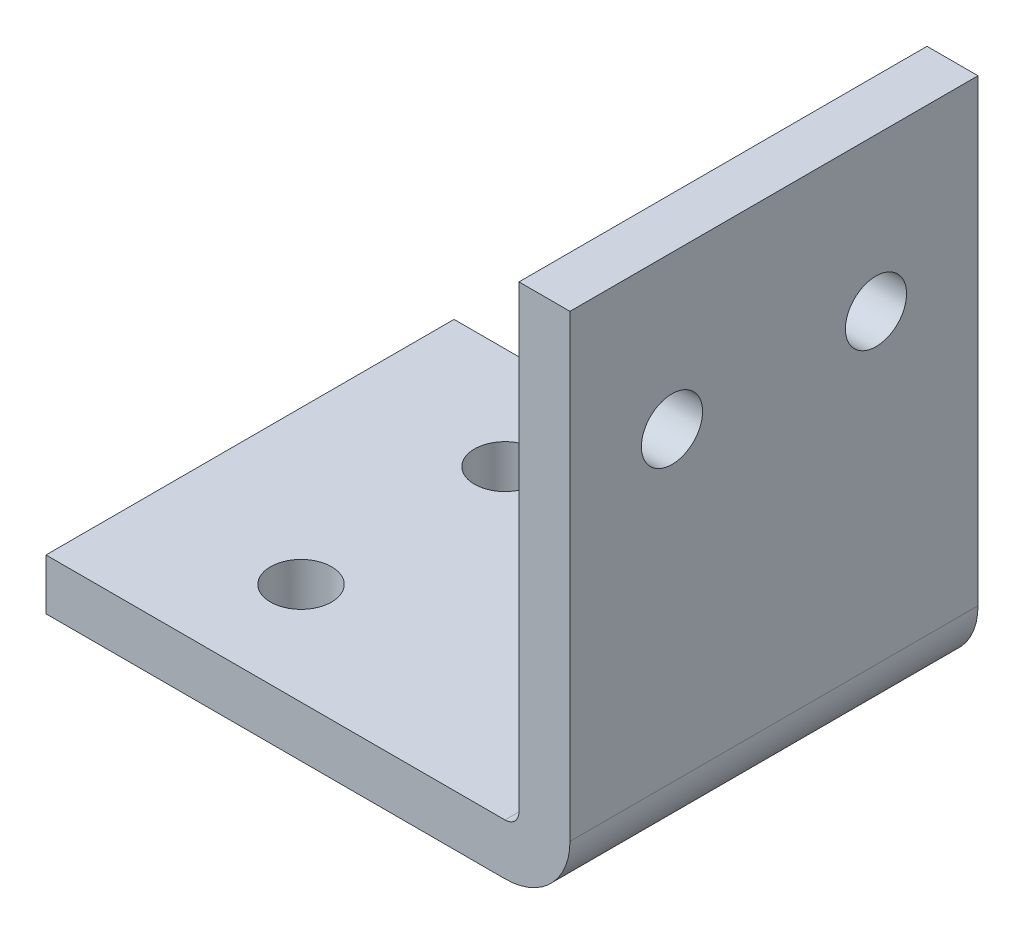
ISO-10303-21;
HEADER;
FILE_DESCRIPTION(('STEP AP214'),'2;1');
FILE_NAME('part.step','',(''),(''),'','','');
FILE_SCHEMA(('AUTOMOTIVE_DESIGN { 1 0 10303 214 1 1 1 1 }'));
ENDSEC;
DATA;
#1=APPLICATION_CONTEXT('core data for automotive mechanical design processes');
#2=APPLICATION_PROTOCOL_DEFINITION('international standard','automotive_design',2000,#1);
#3=PRODUCT_CONTEXT('',#1,'mechanical');
#4=PRODUCT('Part','Part','',(#3));
#5=PRODUCT_RELATED_PRODUCT_CATEGORY('part','',(#4));
#6=PRODUCT_DEFINITION_FORMATION('','',#4);
#7=PRODUCT_DEFINITION_CONTEXT('part definition',#1,'design');
#8=PRODUCT_DEFINITION('design','',#6,#7);
#9=PRODUCT_DEFINITION_SHAPE('','',#8);
#10=(LENGTH_UNIT() NAMED_UNIT(*) SI_UNIT(.MILLI.,.METRE.));
#11=(NAMED_UNIT(*) PLANE_ANGLE_UNIT() SI_UNIT($,.RADIAN.));
#12=(NAMED_UNIT(*) SI_UNIT($,.STERADIAN.) SOLID_ANGLE_UNIT());
#13=UNCERTAINTY_MEASURE_WITH_UNIT(LENGTH_MEASURE(1.E-05),#10,'distance_accuracy_value','');
#14=(GEOMETRIC_REPRESENTATION_CONTEXT(3) GLOBAL_UNCERTAINTY_ASSIGNED_CONTEXT((#13)) GLOBAL_UNIT_ASSIGNED_CONTEXT((#10,
#11,#12)) REPRESENTATION_CONTEXT('',''));
#15=CARTESIAN_POINT('',(0.,0.,0.));
#16=DIRECTION('',(0.,0.,1.));
#17=DIRECTION('',(1.,0.,0.));
#18=AXIS2_PLACEMENT_3D('',#15,#16,#17);
#19=CARTESIAN_POINT('',(-5.,6.3661977236758,0.));
#20=DIRECTION('',(0.,0.,-1.));
#21=DIRECTION('',(1.,0.,0.));
#22=AXIS2_PLACEMENT_3D('',#19,#20,#21);
#23=CYLINDRICAL_SURFACE('',#22,6.3661977236758);
#24=DIRECTION('',(0.,0.,-1.));
#25=VECTOR('',#24,1.);
#26=CARTESIAN_POINT('',(1.3661977236758,6.36619772367582,0.));
#27=LINE('',#26,#25);
#28=CARTESIAN_POINT('',(1.3661977236758,6.36619772367582,0.));
#29=VERTEX_POINT('',#28);
#30=CARTESIAN_POINT('',(1.36619772367581,6.36619772367582,-40.));
#31=VERTEX_POINT('',#30);
#32=EDGE_CURVE('E302',#29,#31,#27,.T.);
#33=ORIENTED_EDGE('',*,*,#32,.F.);
#34=CARTESIAN_POINT('',(-5.,6.3661977236758,0.));
#35=DIRECTION('',(0.,0.,-1.));
#36=DIRECTION('',(-1.,0.,0.));
#37=AXIS2_PLACEMENT_3D('',#34,#35,#36);
#38=CIRCLE('',#37,6.3661977236758);
#39=CARTESIAN_POINT('',(-5.,0.,0.));
#40=VERTEX_POINT('',#39);
#41=EDGE_CURVE('E355',#40,#29,#38,.F.);
#42=ORIENTED_EDGE('',*,*,#41,.F.);
#43=DIRECTION('',(0.,0.,-1.));
#44=VECTOR('',#43,1.);
#45=CARTESIAN_POINT('',(-5.00000000000001,0.,0.));
#46=LINE('',#45,#44);
#47=CARTESIAN_POINT('',(-5.,0.,-40.));
#48=VERTEX_POINT('',#47);
#49=EDGE_CURVE('E306',#40,#48,#46,.T.);
#50=ORIENTED_EDGE('',*,*,#49,.T.);
#51=CARTESIAN_POINT('',(-5.,6.3661977236758,-40.));
#52=DIRECTION('',(0.,0.,-1.));
#53=DIRECTION('',(-1.,0.,0.));
#54=AXIS2_PLACEMENT_3D('',#51,#52,#53);
#55=CIRCLE('',#54,6.3661977236758);
#56=EDGE_CURVE('E107',#31,#48,#55,.T.);
#57=ORIENTED_EDGE('',*,*,#56,.F.);
#58=EDGE_LOOP('',(#33,#42,#50,#57));
#59=FACE_BOUND('',#58,.T.);
#60=ADVANCED_FACE('F103',(#59),#23,.T.);
#61=CARTESIAN_POINT('',(0.,5.,0.));
#62=DIRECTION('',(0.,1.,0.));
#63=DIRECTION('',(0.,0.,1.));
#64=AXIS2_PLACEMENT_3D('',#61,#62,#63);
#65=PLANE('',#64);
#66=CARTESIAN_POINT('',(-35.,5.,-30.));
#67=DIRECTION('',(0.,1.,0.));
#68=DIRECTION('',(0.,0.,1.));
#69=AXIS2_PLACEMENT_3D('',#66,#67,#68);
#70=CIRCLE('',#69,2.99999999999999);
#71=CARTESIAN_POINT('',(-35.,5.,-27.));
#72=VERTEX_POINT('',#71);
#73=EDGE_CURVE('E412',#72,#72,#70,.T.);
#74=ORIENTED_EDGE('',*,*,#73,.F.);
#75=EDGE_LOOP('',(#74));
#76=FACE_BOUND('',#75,.T.);
#77=CARTESIAN_POINT('',(-35.,5.,-10.));
#78=DIRECTION('',(0.,1.,0.));
#79=DIRECTION('',(0.,0.,-1.));
#80=AXIS2_PLACEMENT_3D('',#77,#78,#79);
#81=CIRCLE('',#80,2.99999999999999);
#82=CARTESIAN_POINT('',(-35.,5.,-13.));
#83=VERTEX_POINT('',#82);
#84=EDGE_CURVE('E418',#83,#83,#81,.T.);
#85=ORIENTED_EDGE('',*,*,#84,.F.);
#86=EDGE_LOOP('',(#85));
#87=FACE_BOUND('',#86,.T.);
#88=DIRECTION('',(0.,0.,-1.));
#89=VECTOR('',#88,1.);
#90=CARTESIAN_POINT('',(-5.00000000000001,5.,0.));
#91=LINE('',#90,#89);
#92=CARTESIAN_POINT('',(-5.00000000000001,5.,-11.5));
#93=VERTEX_POINT('',#92);
#94=CARTESIAN_POINT('',(-5.,5.,-28.5));
#95=VERTEX_POINT('',#94);
#96=EDGE_CURVE('E314',#93,#95,#91,.T.);
#97=ORIENTED_EDGE('',*,*,#96,.T.);
#98=DIRECTION('',(-1.,0.,0.));
#99=VECTOR('',#98,1.);
#100=CARTESIAN_POINT('',(0.,5.,-28.5));
#101=LINE('',#100,#99);
#102=CARTESIAN_POINT('',(-10.,5.,-28.5));
#103=VERTEX_POINT('',#102);
#104=EDGE_CURVE('E232',#95,#103,#101,.T.);
#105=ORIENTED_EDGE('',*,*,#104,.T.);
#106=DIRECTION('',(0.,0.,-1.));
#107=VECTOR('',#106,1.);
#108=CARTESIAN_POINT('',(-10.,5.,0.));
#109=LINE('',#108,#107);
#110=CARTESIAN_POINT('',(-10.,5.,-31.5));
#111=VERTEX_POINT('',#110);
#112=EDGE_CURVE('E231',#103,#111,#109,.T.);
#113=ORIENTED_EDGE('',*,*,#112,.T.);
#114=DIRECTION('',(-1.,0.,0.));
#115=VECTOR('',#114,1.);
#116=CARTESIAN_POINT('',(0.,5.,-31.5));
#117=LINE('',#116,#115);
#118=CARTESIAN_POINT('',(-5.,5.,-31.5));
#119=VERTEX_POINT('',#118);
#120=EDGE_CURVE('E236',#119,#111,#117,.T.);
#121=ORIENTED_EDGE('',*,*,#120,.F.);
#122=CARTESIAN_POINT('',(-5.,5.,-40.));
#123=VERTEX_POINT('',#122);
#124=EDGE_CURVE('E315',#119,#123,#91,.T.);
#125=ORIENTED_EDGE('',*,*,#124,.T.);
#126=DIRECTION('',(-1.,0.,0.));
#127=VECTOR('',#126,1.);
#128=CARTESIAN_POINT('',(50.,5.,-40.));
#129=LINE('',#128,#127);
#130=CARTESIAN_POINT('',(-50.,5.,-40.));
#131=VERTEX_POINT('',#130);
#132=EDGE_CURVE('E354',#123,#131,#129,.T.);
#133=ORIENTED_EDGE('',*,*,#132,.T.);
#134=DIRECTION('',(0.,0.,1.));
#135=VECTOR('',#134,1.);
#136=CARTESIAN_POINT('',(-50.,5.,0.));
#137=LINE('',#136,#135);
#138=CARTESIAN_POINT('',(-50.,5.,0.));
#139=VERTEX_POINT('',#138);
#140=EDGE_CURVE('E350',#131,#139,#137,.T.);
#141=ORIENTED_EDGE('',*,*,#140,.T.);
#142=DIRECTION('',(1.,0.,0.));
#143=VECTOR('',#142,1.);
#144=CARTESIAN_POINT('',(-50.,5.,0.));
#145=LINE('',#144,#143);
#146=CARTESIAN_POINT('',(-5.,5.,0.));
#147=VERTEX_POINT('',#146);
#148=EDGE_CURVE('E310',#139,#147,#145,.T.);
#149=ORIENTED_EDGE('',*,*,#148,.T.);
#150=CARTESIAN_POINT('',(-5.00000000000001,5.,-8.5));
#151=VERTEX_POINT('',#150);
#152=EDGE_CURVE('E311',#147,#151,#91,.T.);
#153=ORIENTED_EDGE('',*,*,#152,.T.);
#154=DIRECTION('',(-1.,0.,0.));
#155=VECTOR('',#154,1.);
#156=CARTESIAN_POINT('',(0.,5.,-8.5));
#157=LINE('',#156,#155);
#158=CARTESIAN_POINT('',(-10.,5.,-8.5));
#159=VERTEX_POINT('',#158);
#160=EDGE_CURVE('E129',#151,#159,#157,.T.);
#161=ORIENTED_EDGE('',*,*,#160,.T.);
#162=DIRECTION('',(0.,0.,-1.));
#163=VECTOR('',#162,1.);
#164=CARTESIAN_POINT('',(-10.,5.,0.));
#165=LINE('',#164,#163);
#166=CARTESIAN_POINT('',(-10.,5.,-11.5));
#167=VERTEX_POINT('',#166);
#168=EDGE_CURVE('E294',#159,#167,#165,.T.);
#169=ORIENTED_EDGE('',*,*,#168,.T.);
#170=DIRECTION('',(-1.,0.,0.));
#171=VECTOR('',#170,1.);
#172=CARTESIAN_POINT('',(0.,5.,-11.5));
#173=LINE('',#172,#171);
#174=EDGE_CURVE('E278',#93,#167,#173,.T.);
#175=ORIENTED_EDGE('',*,*,#174,.F.);
#176=EDGE_LOOP('',(#97,#105,#113,#121,#125,#133,#141,#149,#153,#161,#169,#175));
#177=FACE_BOUND('',#176,.T.);
#178=ADVANCED_FACE('F461',(#76,#87,#177),#65,.T.);
#179=CARTESIAN_POINT('',(-3.63380227632418,1.3661977236758,0.));
#180=DIRECTION('',(-1.,0.,0.));
#181=DIRECTION('',(0.,0.,1.));
#182=AXIS2_PLACEMENT_3D('',#179,#180,#181);
#183=PLANE('',#182);
#184=CARTESIAN_POINT('',(-3.63380227632427,36.3661977236758,-30.));
#185=DIRECTION('',(-1.,0.,0.));
#186=DIRECTION('',(0.,0.,-1.));
#187=AXIS2_PLACEMENT_3D('',#184,#185,#186);
#188=CIRCLE('',#187,2.99999999999999);
#189=CARTESIAN_POINT('',(-3.63380227632427,36.3661977236758,-33.));
#190=VERTEX_POINT('',#189);
#191=EDGE_CURVE('E297',#190,#190,#188,.T.);
#192=ORIENTED_EDGE('',*,*,#191,.F.);
#193=EDGE_LOOP('',(#192));
#194=FACE_BOUND('',#193,.T.);
#195=CARTESIAN_POINT('',(-3.63380227632427,36.3661977236758,-10.));
#196=DIRECTION('',(-1.,0.,0.));
#197=DIRECTION('',(0.,0.,1.));
#198=AXIS2_PLACEMENT_3D('',#195,#196,#197);
#199=CIRCLE('',#198,2.99999999999999);
#200=CARTESIAN_POINT('',(-3.63380227632427,36.3661977236758,-7.00000000000001));
#201=VERTEX_POINT('',#200);
#202=EDGE_CURVE('E424',#201,#201,#199,.T.);
#203=ORIENTED_EDGE('',*,*,#202,.F.);
#204=EDGE_LOOP('',(#203));
#205=FACE_BOUND('',#204,.T.);
#206=DIRECTION('',(0.,0.,1.));
#207=VECTOR('',#206,1.);
#208=CARTESIAN_POINT('',(-3.63380227632421,11.3661977236758,0.));
#209=LINE('',#208,#207);
#210=CARTESIAN_POINT('',(-3.63380227632421,11.3661977236758,-31.5));
#211=VERTEX_POINT('',#210);
#212=CARTESIAN_POINT('',(-3.63380227632421,11.3661977236758,-28.5));
#213=VERTEX_POINT('',#212);
#214=EDGE_CURVE('E222',#211,#213,#209,.T.);
#215=ORIENTED_EDGE('',*,*,#214,.T.);
#216=DIRECTION('',(0.,-1.,0.));
#217=VECTOR('',#216,1.);
#218=CARTESIAN_POINT('',(-3.63380227632418,1.3661977236758,-28.5));
#219=LINE('',#218,#217);
#220=CARTESIAN_POINT('',(-3.63380227632419,6.36619772367581,-28.5));
#221=VERTEX_POINT('',#220);
#222=EDGE_CURVE('E254',#213,#221,#219,.T.);
#223=ORIENTED_EDGE('',*,*,#222,.T.);
#224=DIRECTION('',(0.,0.,-1.));
#225=VECTOR('',#224,1.);
#226=CARTESIAN_POINT('',(-3.6338022763242,6.36619772367581,0.));
#227=LINE('',#226,#225);
#228=CARTESIAN_POINT('',(-3.6338022763242,6.36619772367581,-11.5));
#229=VERTEX_POINT('',#228);
#230=EDGE_CURVE('E301',#229,#221,#227,.T.);
#231=ORIENTED_EDGE('',*,*,#230,.F.);
#232=DIRECTION('',(0.,-1.,0.));
#233=VECTOR('',#232,1.);
#234=CARTESIAN_POINT('',(-3.63380227632418,1.3661977236758,-11.5));
#235=LINE('',#234,#233);
#236=CARTESIAN_POINT('',(-3.63380227632421,11.3661977236758,-11.5));
#237=VERTEX_POINT('',#236);
#238=EDGE_CURVE('E267',#237,#229,#235,.T.);
#239=ORIENTED_EDGE('',*,*,#238,.F.);
#240=DIRECTION('',(0.,0.,1.));
#241=VECTOR('',#240,1.);
#242=CARTESIAN_POINT('',(-3.63380227632421,11.3661977236758,0.));
#243=LINE('',#242,#241);
#244=CARTESIAN_POINT('',(-3.63380227632421,11.3661977236758,-8.5));
#245=VERTEX_POINT('',#244);
#246=EDGE_CURVE('E291',#237,#245,#243,.T.);
#247=ORIENTED_EDGE('',*,*,#246,.T.);
#248=DIRECTION('',(0.,-1.,0.));
#249=VECTOR('',#248,1.);
#250=CARTESIAN_POINT('',(-3.63380227632418,1.3661977236758,-8.5));
#251=LINE('',#250,#249);
#252=CARTESIAN_POINT('',(-3.6338022763242,6.36619772367581,-8.5));
#253=VERTEX_POINT('',#252);
#254=EDGE_CURVE('E282',#245,#253,#251,.T.);
#255=ORIENTED_EDGE('',*,*,#254,.T.);
#256=CARTESIAN_POINT('',(-3.6338022763242,6.36619772367581,0.));
#257=VERTEX_POINT('',#256);
#258=EDGE_CURVE('E113',#257,#253,#227,.T.);
#259=ORIENTED_EDGE('',*,*,#258,.F.);
#260=DIRECTION('',(0.,1.,0.));
#261=VECTOR('',#260,1.);
#262=CARTESIAN_POINT('',(-3.63380227632407,-48.6338022763242,0.));
#263=LINE('',#262,#261);
#264=CARTESIAN_POINT('',(-3.6338022763243,51.3661977236758,0.));
#265=VERTEX_POINT('',#264);
#266=EDGE_CURVE('E346',#257,#265,#263,.T.);
#267=ORIENTED_EDGE('',*,*,#266,.T.);
#268=DIRECTION('',(0.,0.,-1.));
#269=VECTOR('',#268,1.);
#270=CARTESIAN_POINT('',(-3.6338022763243,51.3661977236758,0.));
#271=LINE('',#270,#269);
#272=CARTESIAN_POINT('',(-3.6338022763243,51.3661977236758,-40.));
#273=VERTEX_POINT('',#272);
#274=EDGE_CURVE('E349',#265,#273,#271,.T.);
#275=ORIENTED_EDGE('',*,*,#274,.T.);
#276=DIRECTION('',(0.,-1.,0.));
#277=VECTOR('',#276,1.);
#278=CARTESIAN_POINT('',(-3.6338022763243,51.3661977236758,-40.));
#279=LINE('',#278,#277);
#280=CARTESIAN_POINT('',(-3.63380227632419,6.36619772367581,-40.));
#281=VERTEX_POINT('',#280);
#282=EDGE_CURVE('E358',#273,#281,#279,.T.);
#283=ORIENTED_EDGE('',*,*,#282,.T.);
#284=CARTESIAN_POINT('',(-3.63380227632419,6.36619772367581,-31.5));
#285=VERTEX_POINT('',#284);
#286=EDGE_CURVE('E242',#285,#281,#227,.T.);
#287=ORIENTED_EDGE('',*,*,#286,.F.);
#288=DIRECTION('',(0.,-1.,0.));
#289=VECTOR('',#288,1.);
#290=CARTESIAN_POINT('',(-3.63380227632418,1.3661977236758,-31.5));
#291=LINE('',#290,#289);
#292=EDGE_CURVE('E121',#211,#285,#291,.T.);
#293=ORIENTED_EDGE('',*,*,#292,.F.);
#294=EDGE_LOOP('',(#215,#223,#231,#239,#247,#255,#259,#267,#275,#283,#287,#293));
#295=FACE_BOUND('',#294,.T.);
#296=ADVANCED_FACE('F240',(#194,#205,#295),#183,.T.);
#297=CARTESIAN_POINT('',(-5.,6.3661977236758,0.));
#298=DIRECTION('',(0.,0.,-1.));
#299=DIRECTION('',(1.,0.,0.));
#300=AXIS2_PLACEMENT_3D('',#297,#298,#299);
#301=CYLINDRICAL_SURFACE('',#300,1.3661977236758);
#302=CARTESIAN_POINT('',(-5.,6.3661977236758,-28.5));
#303=DIRECTION('',(0.,0.,-1.));
#304=DIRECTION('',(-1.,0.,0.));
#305=AXIS2_PLACEMENT_3D('',#302,#303,#304);
#306=CIRCLE('',#305,1.3661977236758);
#307=EDGE_CURVE('E248',#95,#221,#306,.F.);
#308=ORIENTED_EDGE('',*,*,#307,.F.);
#309=ORIENTED_EDGE('',*,*,#96,.F.);
#310=CARTESIAN_POINT('',(-5.,6.3661977236758,-11.5));
#311=DIRECTION('',(0.,0.,-1.));
#312=DIRECTION('',(-1.,0.,0.));
#313=AXIS2_PLACEMENT_3D('',#310,#311,#312);
#314=CIRCLE('',#313,1.3661977236758);
#315=EDGE_CURVE('E274',#93,#229,#314,.F.);
#316=ORIENTED_EDGE('',*,*,#315,.T.);
#317=ORIENTED_EDGE('',*,*,#230,.T.);
#318=EDGE_LOOP('',(#308,#309,#316,#317));
#319=FACE_BOUND('',#318,.T.);
#320=ADVANCED_FACE('F496',(#319),#301,.F.);
#321=CARTESIAN_POINT('',(-5.,6.3661977236758,-8.5));
#322=DIRECTION('',(0.,0.,-1.));
#323=DIRECTION('',(-1.,0.,0.));
#324=AXIS2_PLACEMENT_3D('',#321,#322,#323);
#325=CIRCLE('',#324,1.3661977236758);
#326=EDGE_CURVE('E285',#151,#253,#325,.F.);
#327=ORIENTED_EDGE('',*,*,#326,.F.);
#328=ORIENTED_EDGE('',*,*,#152,.F.);
#329=CARTESIAN_POINT('',(-5.,6.3661977236758,0.));
#330=DIRECTION('',(0.,0.,-1.));
#331=DIRECTION('',(-1.,0.,0.));
#332=AXIS2_PLACEMENT_3D('',#329,#330,#331);
#333=CIRCLE('',#332,1.3661977236758);
#334=EDGE_CURVE('E13',#147,#257,#333,.F.);
#335=ORIENTED_EDGE('',*,*,#334,.T.);
#336=ORIENTED_EDGE('',*,*,#258,.T.);
#337=EDGE_LOOP('',(#327,#328,#335,#336));
#338=FACE_BOUND('',#337,.T.);
#339=ADVANCED_FACE('F481',(#338),#301,.F.);
#340=CARTESIAN_POINT('',(6.36619772367573,36.3661977236758,-30.));
#341=DIRECTION('',(-1.,0.,0.));
#342=DIRECTION('',(0.,0.,1.));
#343=AXIS2_PLACEMENT_3D('',#340,#341,#342);
#344=CYLINDRICAL_SURFACE('',#343,2.99999999999999);
#345=ORIENTED_EDGE('',*,*,#191,.T.);
#346=EDGE_LOOP('',(#345));
#347=FACE_BOUND('',#346,.T.);
#348=CARTESIAN_POINT('',(1.36619772367573,36.3661977236758,-30.));
#349=DIRECTION('',(-1.,0.,0.));
#350=DIRECTION('',(0.,0.,1.));
#351=AXIS2_PLACEMENT_3D('',#348,#349,#350);
#352=CIRCLE('',#351,2.99999999999999);
#353=CARTESIAN_POINT('',(1.36619772367573,36.3661977236758,-27.));
#354=VERTEX_POINT('',#353);
#355=EDGE_CURVE('E305',#354,#354,#352,.T.);
#356=ORIENTED_EDGE('',*,*,#355,.F.);
#357=EDGE_LOOP('',(#356));
#358=FACE_BOUND('',#357,.T.);
#359=ADVANCED_FACE('F538',(#347,#358),#344,.F.);
#360=CARTESIAN_POINT('',(6.36619772367573,36.3661977236758,-10.));
#361=DIRECTION('',(-1.,0.,0.));
#362=DIRECTION('',(0.,0.,1.));
#363=AXIS2_PLACEMENT_3D('',#360,#361,#362);
#364=CYLINDRICAL_SURFACE('',#363,2.99999999999999);
#365=ORIENTED_EDGE('',*,*,#202,.T.);
#366=EDGE_LOOP('',(#365));
#367=FACE_BOUND('',#366,.T.);
#368=CARTESIAN_POINT('',(1.36619772367573,36.3661977236758,-10.));
#369=DIRECTION('',(-1.,0.,0.));
#370=DIRECTION('',(0.,0.,1.));
#371=AXIS2_PLACEMENT_3D('',#368,#369,#370);
#372=CIRCLE('',#371,2.99999999999999);
#373=CARTESIAN_POINT('',(1.36619772367573,36.3661977236758,-7.00000000000001));
#374=VERTEX_POINT('',#373);
#375=EDGE_CURVE('E375',#374,#374,#372,.T.);
#376=ORIENTED_EDGE('',*,*,#375,.F.);
#377=EDGE_LOOP('',(#376));
#378=FACE_BOUND('',#377,.T.);
#379=ADVANCED_FACE('F534',(#367,#378),#364,.F.);
#380=CARTESIAN_POINT('',(-35.,-5.,-10.));
#381=DIRECTION('',(0.,1.,0.));
#382=DIRECTION('',(0.,0.,1.));
#383=AXIS2_PLACEMENT_3D('',#380,#381,#382);
#384=CYLINDRICAL_SURFACE('',#383,2.99999999999999);
#385=ORIENTED_EDGE('',*,*,#84,.T.);
#386=EDGE_LOOP('',(#385));
#387=FACE_BOUND('',#386,.T.);
#388=CARTESIAN_POINT('',(-35.,0.,-10.));
#389=DIRECTION('',(0.,1.,0.));
#390=DIRECTION('',(0.,0.,1.));
#391=AXIS2_PLACEMENT_3D('',#388,#389,#390);
#392=CIRCLE('',#391,2.99999999999999);
#393=CARTESIAN_POINT('',(-35.,0.,-7.00000000000001));
#394=VERTEX_POINT('',#393);
#395=EDGE_CURVE('E361',#394,#394,#392,.T.);
#396=ORIENTED_EDGE('',*,*,#395,.F.);
#397=EDGE_LOOP('',(#396));
#398=FACE_BOUND('',#397,.T.);
#399=ADVANCED_FACE('F537',(#387,#398),#384,.F.);
#400=CARTESIAN_POINT('',(-35.,-5.,-30.));
#401=DIRECTION('',(0.,1.,0.));
#402=DIRECTION('',(0.,0.,1.));
#403=AXIS2_PLACEMENT_3D('',#400,#401,#402);
#404=CYLINDRICAL_SURFACE('',#403,2.99999999999999);
#405=ORIENTED_EDGE('',*,*,#73,.T.);
#406=EDGE_LOOP('',(#405));
#407=FACE_BOUND('',#406,.T.);
#408=CARTESIAN_POINT('',(-35.,0.,-30.));
#409=DIRECTION('',(0.,1.,0.));
#410=DIRECTION('',(0.,0.,1.));
#411=AXIS2_PLACEMENT_3D('',#408,#409,#410);
#412=CIRCLE('',#411,2.99999999999999);
#413=CARTESIAN_POINT('',(-35.,0.,-27.));
#414=VERTEX_POINT('',#413);
#415=EDGE_CURVE('E406',#414,#414,#412,.T.);
#416=ORIENTED_EDGE('',*,*,#415,.F.);
#417=EDGE_LOOP('',(#416));
#418=FACE_BOUND('',#417,.T.);
#419=ADVANCED_FACE('F557',(#407,#418),#404,.F.);
#420=ORIENTED_EDGE('',*,*,#124,.F.);
#421=CARTESIAN_POINT('',(-5.,6.3661977236758,-31.5));
#422=DIRECTION('',(0.,0.,-1.));
#423=DIRECTION('',(-1.,0.,0.));
#424=AXIS2_PLACEMENT_3D('',#421,#422,#423);
#425=CIRCLE('',#424,1.3661977236758);
#426=EDGE_CURVE('E244',#119,#285,#425,.F.);
#427=ORIENTED_EDGE('',*,*,#426,.T.);
#428=ORIENTED_EDGE('',*,*,#286,.T.);
#429=CARTESIAN_POINT('',(-5.,6.3661977236758,-40.));
#430=DIRECTION('',(0.,0.,-1.));
#431=DIRECTION('',(-1.,0.,0.));
#432=AXIS2_PLACEMENT_3D('',#429,#430,#431);
#433=CIRCLE('',#432,1.3661977236758);
#434=EDGE_CURVE('E384',#281,#123,#433,.T.);
#435=ORIENTED_EDGE('',*,*,#434,.T.);
#436=EDGE_LOOP('',(#420,#427,#428,#435));
#437=FACE_BOUND('',#436,.T.);
#438=ADVANCED_FACE('F465',(#437),#301,.F.);
#439=CARTESIAN_POINT('',(-3.6338022763243,51.3661977236758,-40.));
#440=DIRECTION('',(0.,0.,1.));
#441=DIRECTION('',(0.,1.,0.));
#442=AXIS2_PLACEMENT_3D('',#439,#440,#441);
#443=PLANE('',#442);
#444=DIRECTION('',(0.,-1.,0.));
#445=VECTOR('',#444,1.);
#446=CARTESIAN_POINT('',(1.3661977236757,51.3661977236758,-40.));
#447=LINE('',#446,#445);
#448=CARTESIAN_POINT('',(1.3661977236757,51.3661977236758,-40.));
#449=VERTEX_POINT('',#448);
#450=EDGE_CURVE('E319',#449,#31,#447,.T.);
#451=ORIENTED_EDGE('',*,*,#450,.T.);
#452=ORIENTED_EDGE('',*,*,#56,.T.);
#453=DIRECTION('',(-1.,0.,0.));
#454=VECTOR('',#453,1.);
#455=CARTESIAN_POINT('',(50.,0.,-40.));
#456=LINE('',#455,#454);
#457=CARTESIAN_POINT('',(-50.,0.,-40.));
#458=VERTEX_POINT('',#457);
#459=EDGE_CURVE('E340',#48,#458,#456,.T.);
#460=ORIENTED_EDGE('',*,*,#459,.T.);
#461=DIRECTION('',(0.,-1.,0.));
#462=VECTOR('',#461,1.);
#463=CARTESIAN_POINT('',(-50.,5.,-40.));
#464=LINE('',#463,#462);
#465=EDGE_CURVE('E323',#131,#458,#464,.T.);
#466=ORIENTED_EDGE('',*,*,#465,.F.);
#467=ORIENTED_EDGE('',*,*,#132,.F.);
#468=ORIENTED_EDGE('',*,*,#434,.F.);
#469=ORIENTED_EDGE('',*,*,#282,.F.);
#470=DIRECTION('',(1.,0.,0.));
#471=VECTOR('',#470,1.);
#472=CARTESIAN_POINT('',(-3.6338022763243,51.3661977236758,-40.));
#473=LINE('',#472,#471);
#474=EDGE_CURVE('E316',#273,#449,#473,.T.);
#475=ORIENTED_EDGE('',*,*,#474,.T.);
#476=EDGE_LOOP('',(#451,#452,#460,#466,#467,#468,#469,#475));
#477=FACE_BOUND('',#476,.T.);
#478=ADVANCED_FACE('F446',(#477),#443,.F.);
#479=CARTESIAN_POINT('',(-3.63380227632407,-48.6338022763242,0.));
#480=DIRECTION('',(0.,0.,-1.));
#481=DIRECTION('',(0.,-1.,0.));
#482=AXIS2_PLACEMENT_3D('',#479,#480,#481);
#483=PLANE('',#482);
#484=ORIENTED_EDGE('',*,*,#266,.F.);
#485=ORIENTED_EDGE('',*,*,#334,.F.);
#486=ORIENTED_EDGE('',*,*,#148,.F.);
#487=DIRECTION('',(0.,-1.,0.));
#488=VECTOR('',#487,1.);
#489=CARTESIAN_POINT('',(-50.,5.,0.));
#490=LINE('',#489,#488);
#491=CARTESIAN_POINT('',(-50.,0.,0.));
#492=VERTEX_POINT('',#491);
#493=EDGE_CURVE('E327',#139,#492,#490,.T.);
#494=ORIENTED_EDGE('',*,*,#493,.T.);
#495=DIRECTION('',(1.,0.,0.));
#496=VECTOR('',#495,1.);
#497=CARTESIAN_POINT('',(-50.,0.,0.));
#498=LINE('',#497,#496);
#499=EDGE_CURVE('E333',#492,#40,#498,.T.);
#500=ORIENTED_EDGE('',*,*,#499,.T.);
#501=ORIENTED_EDGE('',*,*,#41,.T.);
#502=DIRECTION('',(0.,1.,0.));
#503=VECTOR('',#502,1.);
#504=CARTESIAN_POINT('',(1.36619772367593,-48.6338022763242,0.));
#505=LINE('',#504,#503);
#506=CARTESIAN_POINT('',(1.3661977236757,51.3661977236758,0.));
#507=VERTEX_POINT('',#506);
#508=EDGE_CURVE('E320',#29,#507,#505,.T.);
#509=ORIENTED_EDGE('',*,*,#508,.T.);
#510=DIRECTION('',(1.,0.,0.));
#511=VECTOR('',#510,1.);
#512=CARTESIAN_POINT('',(-3.6338022763243,51.3661977236758,0.));
#513=LINE('',#512,#511);
#514=EDGE_CURVE('E336',#265,#507,#513,.T.);
#515=ORIENTED_EDGE('',*,*,#514,.F.);
#516=EDGE_LOOP('',(#484,#485,#486,#494,#500,#501,#509,#515));
#517=FACE_BOUND('',#516,.T.);
#518=ADVANCED_FACE('F477',(#517),#483,.F.);
#519=CARTESIAN_POINT('',(1.36619772367582,1.36619772367582,0.));
#520=DIRECTION('',(-1.,0.,0.));
#521=DIRECTION('',(0.,0.,1.));
#522=AXIS2_PLACEMENT_3D('',#519,#520,#521);
#523=PLANE('',#522);
#524=ORIENTED_EDGE('',*,*,#375,.T.);
#525=EDGE_LOOP('',(#524));
#526=FACE_BOUND('',#525,.T.);
#527=ORIENTED_EDGE('',*,*,#355,.T.);
#528=EDGE_LOOP('',(#527));
#529=FACE_BOUND('',#528,.T.);
#530=ORIENTED_EDGE('',*,*,#508,.F.);
#531=ORIENTED_EDGE('',*,*,#32,.T.);
#532=ORIENTED_EDGE('',*,*,#450,.F.);
#533=DIRECTION('',(0.,0.,-1.));
#534=VECTOR('',#533,1.);
#535=CARTESIAN_POINT('',(1.3661977236757,51.3661977236758,0.));
#536=LINE('',#535,#534);
#537=EDGE_CURVE('E339',#507,#449,#536,.T.);
#538=ORIENTED_EDGE('',*,*,#537,.F.);
#539=EDGE_LOOP('',(#530,#531,#532,#538));
#540=FACE_BOUND('',#539,.T.);
#541=ADVANCED_FACE('F475',(#526,#529,#540),#523,.F.);
#542=CARTESIAN_POINT('',(-3.6338022763243,51.3661977236758,0.));
#543=DIRECTION('',(0.,-1.,0.));
#544=DIRECTION('',(0.,0.,1.));
#545=AXIS2_PLACEMENT_3D('',#542,#543,#544);
#546=PLANE('',#545);
#547=ORIENTED_EDGE('',*,*,#537,.T.);
#548=ORIENTED_EDGE('',*,*,#474,.F.);
#549=ORIENTED_EDGE('',*,*,#274,.F.);
#550=ORIENTED_EDGE('',*,*,#514,.T.);
#551=EDGE_LOOP('',(#547,#548,#549,#550));
#552=FACE_BOUND('',#551,.T.);
#553=ADVANCED_FACE('F470',(#552),#546,.F.);
#554=CARTESIAN_POINT('',(-50.,5.,0.));
#555=DIRECTION('',(1.,0.,0.));
#556=DIRECTION('',(0.,0.,-1.));
#557=AXIS2_PLACEMENT_3D('',#554,#555,#556);
#558=PLANE('',#557);
#559=DIRECTION('',(0.,0.,1.));
#560=VECTOR('',#559,1.);
#561=CARTESIAN_POINT('',(-50.,0.,0.));
#562=LINE('',#561,#560);
#563=EDGE_CURVE('E326',#458,#492,#562,.T.);
#564=ORIENTED_EDGE('',*,*,#563,.T.);
#565=ORIENTED_EDGE('',*,*,#493,.F.);
#566=ORIENTED_EDGE('',*,*,#140,.F.);
#567=ORIENTED_EDGE('',*,*,#465,.T.);
#568=EDGE_LOOP('',(#564,#565,#566,#567));
#569=FACE_BOUND('',#568,.T.);
#570=ADVANCED_FACE('F455',(#569),#558,.F.);
#571=CARTESIAN_POINT('',(0.,0.,0.));
#572=DIRECTION('',(0.,1.,0.));
#573=DIRECTION('',(0.,0.,1.));
#574=AXIS2_PLACEMENT_3D('',#571,#572,#573);
#575=PLANE('',#574);
#576=ORIENTED_EDGE('',*,*,#459,.F.);
#577=ORIENTED_EDGE('',*,*,#49,.F.);
#578=ORIENTED_EDGE('',*,*,#499,.F.);
#579=ORIENTED_EDGE('',*,*,#563,.F.);
#580=EDGE_LOOP('',(#576,#577,#578,#579));
#581=FACE_BOUND('',#580,.T.);
#582=ORIENTED_EDGE('',*,*,#395,.T.);
#583=EDGE_LOOP('',(#582));
#584=FACE_BOUND('',#583,.T.);
#585=ORIENTED_EDGE('',*,*,#415,.T.);
#586=EDGE_LOOP('',(#585));
#587=FACE_BOUND('',#586,.T.);
#588=ADVANCED_FACE('F105',(#581,#584,#587),#575,.F.);
#589=CARTESIAN_POINT('',(0.,0.,-11.5));
#590=DIRECTION('',(0.,0.,-1.));
#591=DIRECTION('',(-1.,0.,0.));
#592=AXIS2_PLACEMENT_3D('',#589,#590,#591);
#593=PLANE('',#592);
#594=ORIENTED_EDGE('',*,*,#315,.F.);
#595=ORIENTED_EDGE('',*,*,#174,.T.);
#596=DIRECTION('',(-0.707106781186548,-0.707106781186547,0.));
#597=VECTOR('',#596,1.);
#598=CARTESIAN_POINT('',(-15.,0.,-11.5));
#599=LINE('',#598,#597);
#600=EDGE_CURVE('E262',#237,#167,#599,.T.);
#601=ORIENTED_EDGE('',*,*,#600,.F.);
#602=ORIENTED_EDGE('',*,*,#238,.T.);
#603=EDGE_LOOP('',(#594,#595,#601,#602));
#604=FACE_BOUND('',#603,.T.);
#605=ADVANCED_FACE('F492',(#604),#593,.T.);
#606=CARTESIAN_POINT('',(0.,0.,-8.5));
#607=DIRECTION('',(0.,0.,-1.));
#608=DIRECTION('',(-1.,0.,0.));
#609=AXIS2_PLACEMENT_3D('',#606,#607,#608);
#610=PLANE('',#609);
#611=ORIENTED_EDGE('',*,*,#160,.F.);
#612=ORIENTED_EDGE('',*,*,#326,.T.);
#613=ORIENTED_EDGE('',*,*,#254,.F.);
#614=DIRECTION('',(-0.707106781186548,-0.707106781186547,0.));
#615=VECTOR('',#614,1.);
#616=CARTESIAN_POINT('',(-15.,0.,-8.5));
#617=LINE('',#616,#615);
#618=EDGE_CURVE('E263',#245,#159,#617,.T.);
#619=ORIENTED_EDGE('',*,*,#618,.T.);
#620=EDGE_LOOP('',(#611,#612,#613,#619));
#621=FACE_BOUND('',#620,.T.);
#622=ADVANCED_FACE('F483',(#621),#610,.F.);
#623=CARTESIAN_POINT('',(-15.,0.,-8.5));
#624=DIRECTION('',(0.707106781186547,-0.707106781186548,0.));
#625=DIRECTION('',(0.707106781186548,0.707106781186547,0.));
#626=AXIS2_PLACEMENT_3D('',#623,#624,#625);
#627=PLANE('',#626);
#628=ORIENTED_EDGE('',*,*,#168,.F.);
#629=ORIENTED_EDGE('',*,*,#618,.F.);
#630=ORIENTED_EDGE('',*,*,#246,.F.);
#631=ORIENTED_EDGE('',*,*,#600,.T.);
#632=EDGE_LOOP('',(#628,#629,#630,#631));
#633=FACE_BOUND('',#632,.T.);
#634=ADVANCED_FACE('F487',(#633),#627,.F.);
#635=CARTESIAN_POINT('',(0.,0.,-31.5));
#636=DIRECTION('',(0.,0.,-1.));
#637=DIRECTION('',(-1.,0.,0.));
#638=AXIS2_PLACEMENT_3D('',#635,#636,#637);
#639=PLANE('',#638);
#640=ORIENTED_EDGE('',*,*,#426,.F.);
#641=ORIENTED_EDGE('',*,*,#120,.T.);
#642=DIRECTION('',(-0.707106781186548,-0.707106781186547,0.));
#643=VECTOR('',#642,1.);
#644=CARTESIAN_POINT('',(-15.,0.,-31.5));
#645=LINE('',#644,#643);
#646=EDGE_CURVE('E224',#211,#111,#645,.T.);
#647=ORIENTED_EDGE('',*,*,#646,.F.);
#648=ORIENTED_EDGE('',*,*,#292,.T.);
#649=EDGE_LOOP('',(#640,#641,#647,#648));
#650=FACE_BOUND('',#649,.T.);
#651=ADVANCED_FACE('F234',(#650),#639,.T.);
#652=CARTESIAN_POINT('',(0.,0.,-28.5));
#653=DIRECTION('',(0.,0.,-1.));
#654=DIRECTION('',(-1.,0.,0.));
#655=AXIS2_PLACEMENT_3D('',#652,#653,#654);
#656=PLANE('',#655);
#657=ORIENTED_EDGE('',*,*,#104,.F.);
#658=ORIENTED_EDGE('',*,*,#307,.T.);
#659=ORIENTED_EDGE('',*,*,#222,.F.);
#660=DIRECTION('',(-0.707106781186548,-0.707106781186547,0.));
#661=VECTOR('',#660,1.);
#662=CARTESIAN_POINT('',(-15.,0.,-28.5));
#663=LINE('',#662,#661);
#664=EDGE_CURVE('E227',#213,#103,#663,.T.);
#665=ORIENTED_EDGE('',*,*,#664,.T.);
#666=EDGE_LOOP('',(#657,#658,#659,#665));
#667=FACE_BOUND('',#666,.T.);
#668=ADVANCED_FACE('F500',(#667),#656,.F.);
#669=CARTESIAN_POINT('',(-15.,0.,-28.5));
#670=DIRECTION('',(0.707106781186547,-0.707106781186548,0.));
#671=DIRECTION('',(0.707106781186548,0.707106781186547,0.));
#672=AXIS2_PLACEMENT_3D('',#669,#670,#671);
#673=PLANE('',#672);
#674=ORIENTED_EDGE('',*,*,#112,.F.);
#675=ORIENTED_EDGE('',*,*,#664,.F.);
#676=ORIENTED_EDGE('',*,*,#214,.F.);
#677=ORIENTED_EDGE('',*,*,#646,.T.);
#678=EDGE_LOOP('',(#674,#675,#676,#677));
#679=FACE_BOUND('',#678,.T.);
#680=ADVANCED_FACE('F223',(#679),#673,.F.);
#681=CLOSED_SHELL('',(#60,#178,#296,#320,#339,#359,#379,#399,#419,#438,#478,#518,#541,#553,#570,
#588,#605,#622,#634,#651,#668,#680));
#682=MANIFOLD_SOLID_BREP('B2',#681);
#683=ADVANCED_BREP_SHAPE_REPRESENTATION('',(#18,#682),#14);
#684=SHAPE_DEFINITION_REPRESENTATION(#9,#683);
ENDSEC;
END-ISO-10303-21;
